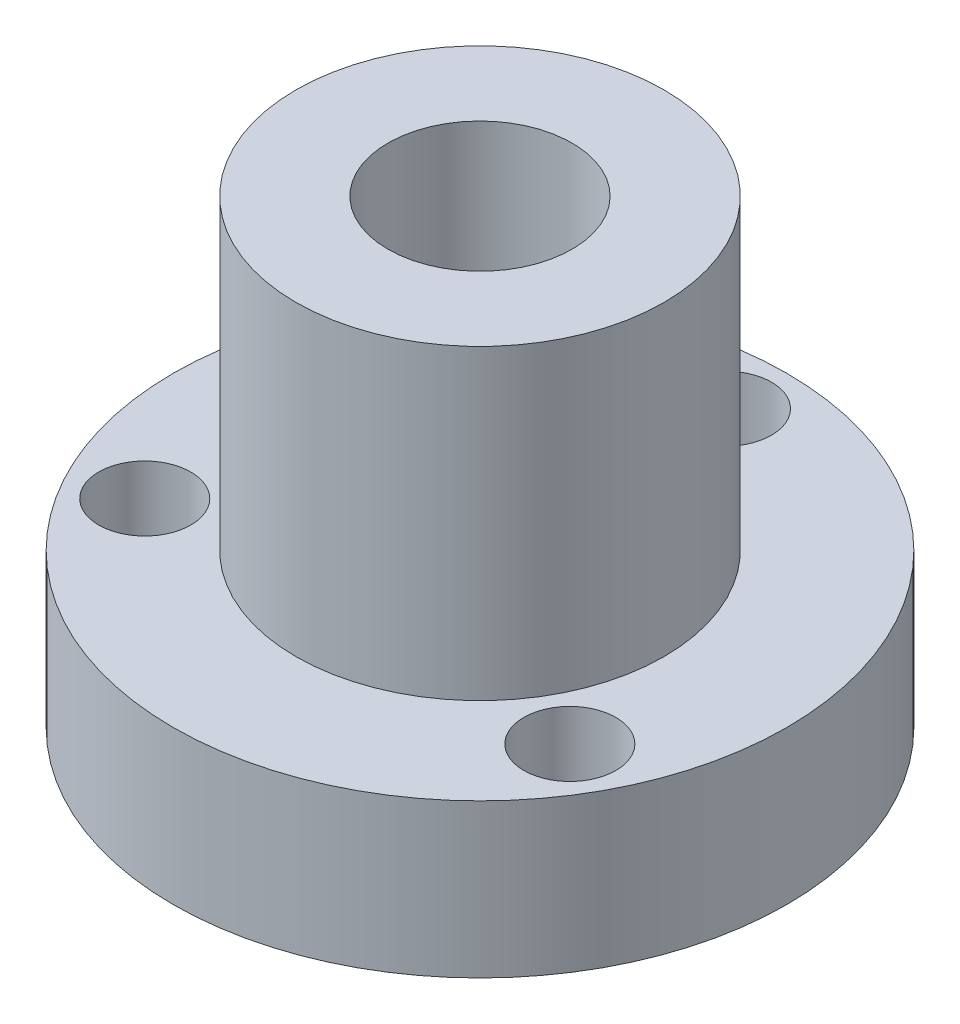
ISO-10303-21;
HEADER;
FILE_DESCRIPTION(('STEP AP214'),'2;1');
FILE_NAME('part.step','',(''),(''),'','','');
FILE_SCHEMA(('AUTOMOTIVE_DESIGN { 1 0 10303 214 1 1 1 1 }'));
ENDSEC;
DATA;
#1=APPLICATION_CONTEXT('core data for automotive mechanical design processes');
#2=APPLICATION_PROTOCOL_DEFINITION('international standard','automotive_design',2000,#1);
#3=PRODUCT_CONTEXT('',#1,'mechanical');
#4=PRODUCT('Part','Part','',(#3));
#5=PRODUCT_RELATED_PRODUCT_CATEGORY('part','',(#4));
#6=PRODUCT_DEFINITION_FORMATION('','',#4);
#7=PRODUCT_DEFINITION_CONTEXT('part definition',#1,'design');
#8=PRODUCT_DEFINITION('design','',#6,#7);
#9=PRODUCT_DEFINITION_SHAPE('','',#8);
#10=(LENGTH_UNIT() NAMED_UNIT(*) SI_UNIT(.MILLI.,.METRE.));
#11=(NAMED_UNIT(*) PLANE_ANGLE_UNIT() SI_UNIT($,.RADIAN.));
#12=(NAMED_UNIT(*) SI_UNIT($,.STERADIAN.) SOLID_ANGLE_UNIT());
#13=UNCERTAINTY_MEASURE_WITH_UNIT(LENGTH_MEASURE(1.E-05),#10,'distance_accuracy_value','');
#14=(GEOMETRIC_REPRESENTATION_CONTEXT(3) GLOBAL_UNCERTAINTY_ASSIGNED_CONTEXT((#13)) GLOBAL_UNIT_ASSIGNED_CONTEXT((#10,
#11,#12)) REPRESENTATION_CONTEXT('',''));
#15=CARTESIAN_POINT('',(0.,0.,0.));
#16=DIRECTION('',(0.,0.,1.));
#17=DIRECTION('',(1.,0.,0.));
#18=AXIS2_PLACEMENT_3D('',#15,#16,#17);
#19=CARTESIAN_POINT('',(0.,5.,0.));
#20=DIRECTION('',(0.,-1.,0.));
#21=DIRECTION('',(0.,0.,-1.));
#22=AXIS2_PLACEMENT_3D('',#19,#20,#21);
#23=CYLINDRICAL_SURFACE('',#22,10.);
#24=CARTESIAN_POINT('',(0.,5.,0.));
#25=DIRECTION('',(0.,1.,0.));
#26=DIRECTION('',(0.,0.,1.));
#27=AXIS2_PLACEMENT_3D('',#24,#25,#26);
#28=CIRCLE('',#27,10.);
#29=CARTESIAN_POINT('',(0.,5.,10.));
#30=VERTEX_POINT('',#29);
#31=EDGE_CURVE('E10',#30,#30,#28,.T.);
#32=ORIENTED_EDGE('',*,*,#31,.F.);
#33=EDGE_LOOP('',(#32));
#34=FACE_BOUND('',#33,.T.);
#35=CARTESIAN_POINT('',(0.,0.,0.));
#36=DIRECTION('',(0.,1.,0.));
#37=DIRECTION('',(0.,0.,1.));
#38=AXIS2_PLACEMENT_3D('',#35,#36,#37);
#39=CIRCLE('',#38,10.);
#40=CARTESIAN_POINT('',(0.,0.,10.));
#41=VERTEX_POINT('',#40);
#42=EDGE_CURVE('E34',#41,#41,#39,.T.);
#43=ORIENTED_EDGE('',*,*,#42,.T.);
#44=EDGE_LOOP('',(#43));
#45=FACE_BOUND('',#44,.T.);
#46=ADVANCED_FACE('F31',(#34,#45),#23,.T.);
#47=CARTESIAN_POINT('',(0.,5.,0.));
#48=DIRECTION('',(0.,1.,0.));
#49=DIRECTION('',(0.,0.,1.));
#50=AXIS2_PLACEMENT_3D('',#47,#48,#49);
#51=PLANE('',#50);
#52=CARTESIAN_POINT('',(6.92820323027602,5.,3.9999999999997));
#53=DIRECTION('',(0.,1.,0.));
#54=DIRECTION('',(0.,0.,1.));
#55=AXIS2_PLACEMENT_3D('',#52,#53,#54);
#56=CIRCLE('',#55,1.50000000000044);
#57=CARTESIAN_POINT('',(6.92820323027602,5.,5.50000000000014));
#58=VERTEX_POINT('',#57);
#59=EDGE_CURVE('E67',#58,#58,#56,.T.);
#60=ORIENTED_EDGE('',*,*,#59,.F.);
#61=EDGE_LOOP('',(#60));
#62=FACE_BOUND('',#61,.T.);
#63=CARTESIAN_POINT('',(-6.928203230275,5.,4.0000000000003));
#64=DIRECTION('',(0.,1.,0.));
#65=DIRECTION('',(0.,0.,1.));
#66=AXIS2_PLACEMENT_3D('',#63,#64,#65);
#67=CIRCLE('',#66,1.50000000000065);
#68=CARTESIAN_POINT('',(-6.928203230275,5.,5.50000000000095));
#69=VERTEX_POINT('',#68);
#70=EDGE_CURVE('E61',#69,#69,#67,.T.);
#71=ORIENTED_EDGE('',*,*,#70,.F.);
#72=EDGE_LOOP('',(#71));
#73=FACE_BOUND('',#72,.T.);
#74=CARTESIAN_POINT('',(0.,5.,-8.));
#75=DIRECTION('',(0.,1.,0.));
#76=DIRECTION('',(0.,0.,1.));
#77=AXIS2_PLACEMENT_3D('',#74,#75,#76);
#78=CIRCLE('',#77,1.5);
#79=CARTESIAN_POINT('',(0.,5.,-6.5));
#80=VERTEX_POINT('',#79);
#81=EDGE_CURVE('E55',#80,#80,#78,.T.);
#82=ORIENTED_EDGE('',*,*,#81,.F.);
#83=EDGE_LOOP('',(#82));
#84=FACE_BOUND('',#83,.T.);
#85=CARTESIAN_POINT('',(0.,5.,0.));
#86=DIRECTION('',(0.,1.,0.));
#87=DIRECTION('',(0.,0.,1.));
#88=AXIS2_PLACEMENT_3D('',#85,#86,#87);
#89=CIRCLE('',#88,6.);
#90=CARTESIAN_POINT('',(0.,5.,6.));
#91=VERTEX_POINT('',#90);
#92=EDGE_CURVE('E43',#91,#91,#89,.T.);
#93=ORIENTED_EDGE('',*,*,#92,.F.);
#94=EDGE_LOOP('',(#93));
#95=FACE_BOUND('',#94,.T.);
#96=ORIENTED_EDGE('',*,*,#31,.T.);
#97=EDGE_LOOP('',(#96));
#98=FACE_BOUND('',#97,.T.);
#99=ADVANCED_FACE('F83',(#62,#73,#84,#95,#98),#51,.T.);
#100=CARTESIAN_POINT('',(0.,0.,0.));
#101=DIRECTION('',(0.,1.,0.));
#102=DIRECTION('',(0.,0.,1.));
#103=AXIS2_PLACEMENT_3D('',#100,#101,#102);
#104=PLANE('',#103);
#105=CARTESIAN_POINT('',(6.92820323027602,0.,3.9999999999997));
#106=DIRECTION('',(0.,1.,0.));
#107=DIRECTION('',(0.,0.,1.));
#108=AXIS2_PLACEMENT_3D('',#105,#106,#107);
#109=CIRCLE('',#108,1.50000000000044);
#110=CARTESIAN_POINT('',(6.92820323027602,0.,5.50000000000014));
#111=VERTEX_POINT('',#110);
#112=EDGE_CURVE('E58',#111,#111,#109,.T.);
#113=ORIENTED_EDGE('',*,*,#112,.T.);
#114=EDGE_LOOP('',(#113));
#115=FACE_BOUND('',#114,.T.);
#116=CARTESIAN_POINT('',(-6.928203230275,0.,4.0000000000003));
#117=DIRECTION('',(0.,1.,0.));
#118=DIRECTION('',(0.,0.,1.));
#119=AXIS2_PLACEMENT_3D('',#116,#117,#118);
#120=CIRCLE('',#119,1.50000000000065);
#121=CARTESIAN_POINT('',(-6.928203230275,0.,5.50000000000095));
#122=VERTEX_POINT('',#121);
#123=EDGE_CURVE('E64',#122,#122,#120,.T.);
#124=ORIENTED_EDGE('',*,*,#123,.T.);
#125=EDGE_LOOP('',(#124));
#126=FACE_BOUND('',#125,.T.);
#127=CARTESIAN_POINT('',(0.,0.,-8.));
#128=DIRECTION('',(0.,1.,0.));
#129=DIRECTION('',(0.,0.,1.));
#130=AXIS2_PLACEMENT_3D('',#127,#128,#129);
#131=CIRCLE('',#130,1.5);
#132=CARTESIAN_POINT('',(0.,0.,-6.5));
#133=VERTEX_POINT('',#132);
#134=EDGE_CURVE('E52',#133,#133,#131,.T.);
#135=ORIENTED_EDGE('',*,*,#134,.T.);
#136=EDGE_LOOP('',(#135));
#137=FACE_BOUND('',#136,.T.);
#138=CARTESIAN_POINT('',(0.,0.,0.));
#139=DIRECTION('',(0.,1.,0.));
#140=DIRECTION('',(0.,0.,1.));
#141=AXIS2_PLACEMENT_3D('',#138,#139,#140);
#142=CIRCLE('',#141,3.);
#143=CARTESIAN_POINT('',(0.,0.,3.));
#144=VERTEX_POINT('',#143);
#145=EDGE_CURVE('E46',#144,#144,#142,.T.);
#146=ORIENTED_EDGE('',*,*,#145,.T.);
#147=EDGE_LOOP('',(#146));
#148=FACE_BOUND('',#147,.T.);
#149=ORIENTED_EDGE('',*,*,#42,.F.);
#150=EDGE_LOOP('',(#149));
#151=FACE_BOUND('',#150,.T.);
#152=ADVANCED_FACE('F73',(#115,#126,#137,#148,#151),#104,.F.);
#153=CARTESIAN_POINT('',(0.,15.,0.));
#154=DIRECTION('',(0.,-1.,0.));
#155=DIRECTION('',(0.,0.,-1.));
#156=AXIS2_PLACEMENT_3D('',#153,#154,#155);
#157=CYLINDRICAL_SURFACE('',#156,6.);
#158=CARTESIAN_POINT('',(0.,15.,0.));
#159=DIRECTION('',(0.,1.,0.));
#160=DIRECTION('',(0.,0.,1.));
#161=AXIS2_PLACEMENT_3D('',#158,#159,#160);
#162=CIRCLE('',#161,6.);
#163=CARTESIAN_POINT('',(0.,15.,6.));
#164=VERTEX_POINT('',#163);
#165=EDGE_CURVE('E41',#164,#164,#162,.T.);
#166=ORIENTED_EDGE('',*,*,#165,.F.);
#167=EDGE_LOOP('',(#166));
#168=FACE_BOUND('',#167,.T.);
#169=ORIENTED_EDGE('',*,*,#92,.T.);
#170=EDGE_LOOP('',(#169));
#171=FACE_BOUND('',#170,.T.);
#172=ADVANCED_FACE('F93',(#168,#171),#157,.T.);
#173=CARTESIAN_POINT('',(0.,15.,0.));
#174=DIRECTION('',(0.,1.,0.));
#175=DIRECTION('',(0.,0.,1.));
#176=AXIS2_PLACEMENT_3D('',#173,#174,#175);
#177=PLANE('',#176);
#178=CARTESIAN_POINT('',(0.,15.,0.));
#179=DIRECTION('',(0.,1.,0.));
#180=DIRECTION('',(0.,0.,1.));
#181=AXIS2_PLACEMENT_3D('',#178,#179,#180);
#182=CIRCLE('',#181,3.);
#183=CARTESIAN_POINT('',(0.,15.,3.));
#184=VERTEX_POINT('',#183);
#185=EDGE_CURVE('E49',#184,#184,#182,.T.);
#186=ORIENTED_EDGE('',*,*,#185,.F.);
#187=EDGE_LOOP('',(#186));
#188=FACE_BOUND('',#187,.T.);
#189=ORIENTED_EDGE('',*,*,#165,.T.);
#190=EDGE_LOOP('',(#189));
#191=FACE_BOUND('',#190,.T.);
#192=ADVANCED_FACE('F95',(#188,#191),#177,.T.);
#193=CARTESIAN_POINT('',(0.,0.,0.));
#194=DIRECTION('',(0.,1.,0.));
#195=DIRECTION('',(0.,0.,1.));
#196=AXIS2_PLACEMENT_3D('',#193,#194,#195);
#197=CYLINDRICAL_SURFACE('',#196,3.);
#198=ORIENTED_EDGE('',*,*,#145,.F.);
#199=EDGE_LOOP('',(#198));
#200=FACE_BOUND('',#199,.T.);
#201=ORIENTED_EDGE('',*,*,#185,.T.);
#202=EDGE_LOOP('',(#201));
#203=FACE_BOUND('',#202,.T.);
#204=ADVANCED_FACE('F102',(#200,#203),#197,.F.);
#205=CARTESIAN_POINT('',(0.,0.,-8.));
#206=DIRECTION('',(0.,1.,0.));
#207=DIRECTION('',(0.,0.,1.));
#208=AXIS2_PLACEMENT_3D('',#205,#206,#207);
#209=CYLINDRICAL_SURFACE('',#208,1.5);
#210=ORIENTED_EDGE('',*,*,#134,.F.);
#211=EDGE_LOOP('',(#210));
#212=FACE_BOUND('',#211,.T.);
#213=ORIENTED_EDGE('',*,*,#81,.T.);
#214=EDGE_LOOP('',(#213));
#215=FACE_BOUND('',#214,.T.);
#216=ADVANCED_FACE('F128',(#212,#215),#209,.F.);
#217=CARTESIAN_POINT('',(-6.928203230275,0.,4.0000000000003));
#218=DIRECTION('',(0.,1.,0.));
#219=DIRECTION('',(0.,0.,1.));
#220=AXIS2_PLACEMENT_3D('',#217,#218,#219);
#221=CYLINDRICAL_SURFACE('',#220,1.50000000000065);
#222=ORIENTED_EDGE('',*,*,#123,.F.);
#223=EDGE_LOOP('',(#222));
#224=FACE_BOUND('',#223,.T.);
#225=ORIENTED_EDGE('',*,*,#70,.T.);
#226=EDGE_LOOP('',(#225));
#227=FACE_BOUND('',#226,.T.);
#228=ADVANCED_FACE('F79',(#224,#227),#221,.F.);
#229=CARTESIAN_POINT('',(6.92820323027602,0.,3.9999999999997));
#230=DIRECTION('',(0.,1.,0.));
#231=DIRECTION('',(0.,0.,1.));
#232=AXIS2_PLACEMENT_3D('',#229,#230,#231);
#233=CYLINDRICAL_SURFACE('',#232,1.50000000000044);
#234=ORIENTED_EDGE('',*,*,#112,.F.);
#235=EDGE_LOOP('',(#234));
#236=FACE_BOUND('',#235,.T.);
#237=ORIENTED_EDGE('',*,*,#59,.T.);
#238=EDGE_LOOP('',(#237));
#239=FACE_BOUND('',#238,.T.);
#240=ADVANCED_FACE('F76',(#236,#239),#233,.F.);
#241=CLOSED_SHELL('',(#46,#99,#152,#172,#192,#204,#216,#228,#240));
#242=MANIFOLD_SOLID_BREP('B2',#241);
#243=ADVANCED_BREP_SHAPE_REPRESENTATION('',(#18,#242),#14);
#244=SHAPE_DEFINITION_REPRESENTATION(#9,#243);
ENDSEC;
END-ISO-10303-21;
